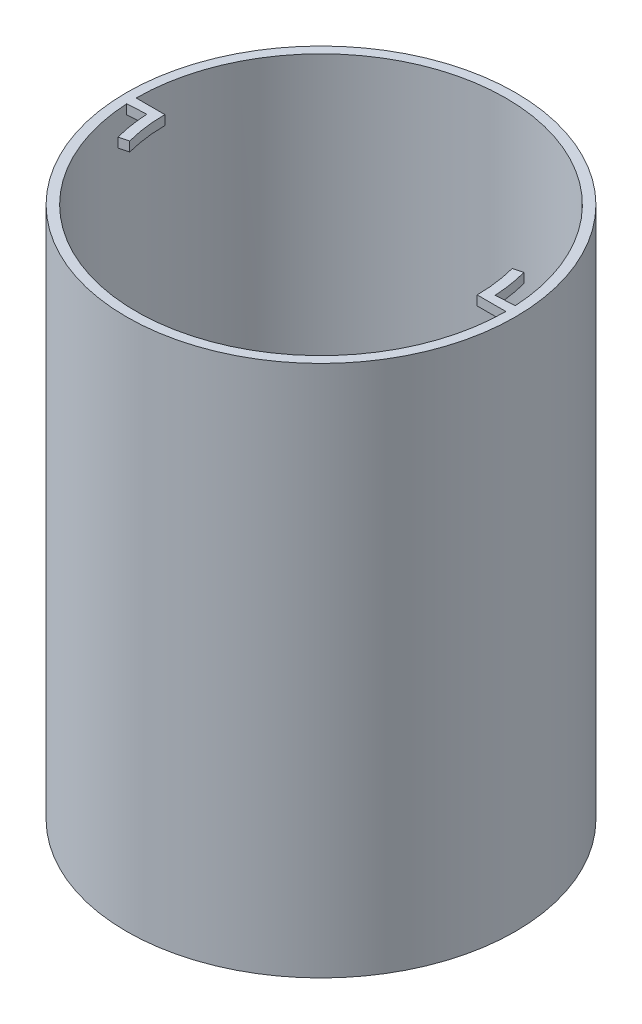
ISO-10303-21;
HEADER;
FILE_DESCRIPTION(('STEP AP214'),'2;1');
FILE_NAME('part.step','',(''),(''),'','','');
FILE_SCHEMA(('AUTOMOTIVE_DESIGN { 1 0 10303 214 1 1 1 1 }'));
ENDSEC;
DATA;
#1=APPLICATION_CONTEXT('core data for automotive mechanical design processes');
#2=APPLICATION_PROTOCOL_DEFINITION('international standard','automotive_design',2000,#1);
#3=PRODUCT_CONTEXT('',#1,'mechanical');
#4=PRODUCT('Part','Part','',(#3));
#5=PRODUCT_RELATED_PRODUCT_CATEGORY('part','',(#4));
#6=PRODUCT_DEFINITION_FORMATION('','',#4);
#7=PRODUCT_DEFINITION_CONTEXT('part definition',#1,'design');
#8=PRODUCT_DEFINITION('design','',#6,#7);
#9=PRODUCT_DEFINITION_SHAPE('','',#8);
#10=(LENGTH_UNIT() NAMED_UNIT(*) SI_UNIT(.MILLI.,.METRE.));
#11=(NAMED_UNIT(*) PLANE_ANGLE_UNIT() SI_UNIT($,.RADIAN.));
#12=(NAMED_UNIT(*) SI_UNIT($,.STERADIAN.) SOLID_ANGLE_UNIT());
#13=UNCERTAINTY_MEASURE_WITH_UNIT(LENGTH_MEASURE(1.E-05),#10,'distance_accuracy_value','');
#14=(GEOMETRIC_REPRESENTATION_CONTEXT(3) GLOBAL_UNCERTAINTY_ASSIGNED_CONTEXT((#13)) GLOBAL_UNIT_ASSIGNED_CONTEXT((#10,
#11,#12)) REPRESENTATION_CONTEXT('',''));
#15=CARTESIAN_POINT('',(0.,0.,0.));
#16=DIRECTION('',(0.,0.,1.));
#17=DIRECTION('',(1.,0.,0.));
#18=AXIS2_PLACEMENT_3D('',#15,#16,#17);
#19=CARTESIAN_POINT('',(0.,0.,0.));
#20=DIRECTION('',(0.,-1.,0.));
#21=DIRECTION('',(0.,0.,-1.));
#22=AXIS2_PLACEMENT_3D('',#19,#20,#21);
#23=CYLINDRICAL_SURFACE('',#22,58.);
#24=CARTESIAN_POINT('',(0.,0.,0.));
#25=DIRECTION('',(0.,-1.,0.));
#26=DIRECTION('',(0.,0.,-1.));
#27=AXIS2_PLACEMENT_3D('',#24,#25,#26);
#28=CIRCLE('',#27,58.);
#29=CARTESIAN_POINT('',(0.,0.,-58.));
#30=VERTEX_POINT('',#29);
#31=EDGE_CURVE('E223',#30,#30,#28,.T.);
#32=ORIENTED_EDGE('',*,*,#31,.T.);
#33=EDGE_LOOP('',(#32));
#34=FACE_BOUND('',#33,.T.);
#35=CARTESIAN_POINT('',(0.,164.,0.));
#36=DIRECTION('',(0.,-1.,0.));
#37=DIRECTION('',(1.,0.,0.));
#38=AXIS2_PLACEMENT_3D('',#35,#36,#37);
#39=CIRCLE('',#38,58.);
#40=CARTESIAN_POINT('',(57.9205130157653,164.,-3.03548546209075));
#41=VERTEX_POINT('',#40);
#42=CARTESIAN_POINT('',(58.,164.,0.));
#43=VERTEX_POINT('',#42);
#44=EDGE_CURVE('E50',#41,#43,#39,.T.);
#45=ORIENTED_EDGE('',*,*,#44,.F.);
#46=DIRECTION('',(0.,1.,0.));
#47=VECTOR('',#46,1.);
#48=CARTESIAN_POINT('',(57.9205130157653,0.,-3.03548546209075));
#49=LINE('',#48,#47);
#50=CARTESIAN_POINT('',(57.9205130157653,167.,-3.03548546209075));
#51=VERTEX_POINT('',#50);
#52=EDGE_CURVE('E192',#41,#51,#49,.T.);
#53=ORIENTED_EDGE('',*,*,#52,.T.);
#54=CARTESIAN_POINT('',(0.,167.,0.));
#55=DIRECTION('',(0.,-1.,0.));
#56=DIRECTION('',(0.,0.,-1.));
#57=AXIS2_PLACEMENT_3D('',#54,#55,#56);
#58=CIRCLE('',#57,58.);
#59=CARTESIAN_POINT('',(-58.,167.,0.));
#60=VERTEX_POINT('',#59);
#61=EDGE_CURVE('E43',#60,#51,#58,.T.);
#62=ORIENTED_EDGE('',*,*,#61,.F.);
#63=DIRECTION('',(0.,1.,0.));
#64=VECTOR('',#63,1.);
#65=CARTESIAN_POINT('',(-58.,0.,0.));
#66=LINE('',#65,#64);
#67=CARTESIAN_POINT('',(-58.,164.,0.));
#68=VERTEX_POINT('',#67);
#69=EDGE_CURVE('E204',#68,#60,#66,.T.);
#70=ORIENTED_EDGE('',*,*,#69,.F.);
#71=CARTESIAN_POINT('',(0.,164.,0.));
#72=DIRECTION('',(0.,-1.,0.));
#73=DIRECTION('',(1.,0.,0.));
#74=AXIS2_PLACEMENT_3D('',#71,#72,#73);
#75=CIRCLE('',#74,58.);
#76=CARTESIAN_POINT('',(-57.9205130157653,164.,3.03548546209075));
#77=VERTEX_POINT('',#76);
#78=EDGE_CURVE('E217',#77,#68,#75,.T.);
#79=ORIENTED_EDGE('',*,*,#78,.F.);
#80=DIRECTION('',(0.,1.,0.));
#81=VECTOR('',#80,1.);
#82=CARTESIAN_POINT('',(-57.9205130157653,0.,3.03548546209075));
#83=LINE('',#82,#81);
#84=CARTESIAN_POINT('',(-57.9205130157653,167.,3.03548546209075));
#85=VERTEX_POINT('',#84);
#86=EDGE_CURVE('E214',#77,#85,#83,.T.);
#87=ORIENTED_EDGE('',*,*,#86,.T.);
#88=CARTESIAN_POINT('',(58.,167.,0.));
#89=VERTEX_POINT('',#88);
#90=EDGE_CURVE('E225',#89,#85,#58,.T.);
#91=ORIENTED_EDGE('',*,*,#90,.F.);
#92=DIRECTION('',(0.,1.,0.));
#93=VECTOR('',#92,1.);
#94=CARTESIAN_POINT('',(58.,0.,0.));
#95=LINE('',#94,#93);
#96=EDGE_CURVE('E55',#43,#89,#95,.T.);
#97=ORIENTED_EDGE('',*,*,#96,.F.);
#98=EDGE_LOOP('',(#45,#53,#62,#70,#79,#87,#91,#97));
#99=FACE_BOUND('',#98,.T.);
#100=ADVANCED_FACE('F35',(#34,#99),#23,.F.);
#101=CARTESIAN_POINT('',(0.,0.,0.));
#102=DIRECTION('',(0.,-1.,0.));
#103=DIRECTION('',(0.,0.,-1.));
#104=AXIS2_PLACEMENT_3D('',#101,#102,#103);
#105=CYLINDRICAL_SURFACE('',#104,61.);
#106=CARTESIAN_POINT('',(0.,167.,0.));
#107=DIRECTION('',(0.,-1.,0.));
#108=DIRECTION('',(0.,0.,-1.));
#109=AXIS2_PLACEMENT_3D('',#106,#107,#108);
#110=CIRCLE('',#109,61.);
#111=CARTESIAN_POINT('',(0.,167.,-61.));
#112=VERTEX_POINT('',#111);
#113=EDGE_CURVE('E11',#112,#112,#110,.T.);
#114=ORIENTED_EDGE('',*,*,#113,.T.);
#115=EDGE_LOOP('',(#114));
#116=FACE_BOUND('',#115,.T.);
#117=CARTESIAN_POINT('',(0.,0.,0.));
#118=DIRECTION('',(0.,-1.,0.));
#119=DIRECTION('',(0.,0.,-1.));
#120=AXIS2_PLACEMENT_3D('',#117,#118,#119);
#121=CIRCLE('',#120,61.);
#122=CARTESIAN_POINT('',(0.,0.,-61.));
#123=VERTEX_POINT('',#122);
#124=EDGE_CURVE('E220',#123,#123,#121,.T.);
#125=ORIENTED_EDGE('',*,*,#124,.F.);
#126=EDGE_LOOP('',(#125));
#127=FACE_BOUND('',#126,.T.);
#128=ADVANCED_FACE('F37',(#116,#127),#105,.T.);
#129=CARTESIAN_POINT('',(61.,167.,0.));
#130=DIRECTION('',(0.,1.,0.));
#131=DIRECTION('',(0.,0.,1.));
#132=AXIS2_PLACEMENT_3D('',#129,#130,#131);
#133=PLANE('',#132);
#134=ORIENTED_EDGE('',*,*,#61,.T.);
#135=DIRECTION('',(-0.998629534754574,0.,0.0523359562429439));
#136=VECTOR('',#135,1.);
#137=CARTESIAN_POINT('',(0.,167.,0.));
#138=LINE('',#137,#136);
#139=CARTESIAN_POINT('',(51.9287358072379,167.,-2.72146972463309));
#140=VERTEX_POINT('',#139);
#141=EDGE_CURVE('E194',#51,#140,#138,.T.);
#142=ORIENTED_EDGE('',*,*,#141,.T.);
#143=CARTESIAN_POINT('',(0.,167.,0.));
#144=DIRECTION('',(0.,-1.,0.));
#145=DIRECTION('',(1.,0.,0.));
#146=AXIS2_PLACEMENT_3D('',#143,#144,#145);
#147=CIRCLE('',#146,52.);
#148=CARTESIAN_POINT('',(50.2281429670316,167.,-13.4585903453311));
#149=VERTEX_POINT('',#148);
#150=EDGE_CURVE('E141',#149,#140,#147,.T.);
#151=ORIENTED_EDGE('',*,*,#150,.F.);
#152=DIRECTION('',(-0.965925826289068,0.,0.258819045102521));
#153=VECTOR('',#152,1.);
#154=CARTESIAN_POINT('',(0.,167.,0.));
#155=LINE('',#154,#153);
#156=CARTESIAN_POINT('',(47.3303654881643,167.,-12.6821332100235));
#157=VERTEX_POINT('',#156);
#158=EDGE_CURVE('E137',#149,#157,#155,.T.);
#159=ORIENTED_EDGE('',*,*,#158,.T.);
#160=CARTESIAN_POINT('',(0.,167.,0.));
#161=DIRECTION('',(0.,-1.,0.));
#162=DIRECTION('',(1.,0.,0.));
#163=AXIS2_PLACEMENT_3D('',#160,#161,#162);
#164=CIRCLE('',#163,49.);
#165=CARTESIAN_POINT('',(49.,167.,0.));
#166=VERTEX_POINT('',#165);
#167=EDGE_CURVE('E132',#157,#166,#164,.T.);
#168=ORIENTED_EDGE('',*,*,#167,.T.);
#169=DIRECTION('',(-1.,0.,0.));
#170=VECTOR('',#169,1.);
#171=CARTESIAN_POINT('',(0.,167.,0.));
#172=LINE('',#171,#170);
#173=EDGE_CURVE('E122',#89,#166,#172,.T.);
#174=ORIENTED_EDGE('',*,*,#173,.F.);
#175=ORIENTED_EDGE('',*,*,#90,.T.);
#176=DIRECTION('',(0.998629534754574,0.,-0.0523359562429439));
#177=VECTOR('',#176,1.);
#178=CARTESIAN_POINT('',(0.,167.,0.));
#179=LINE('',#178,#177);
#180=CARTESIAN_POINT('',(-51.9287358072378,167.,2.72146972463309));
#181=VERTEX_POINT('',#180);
#182=EDGE_CURVE('E211',#85,#181,#179,.T.);
#183=ORIENTED_EDGE('',*,*,#182,.T.);
#184=CARTESIAN_POINT('',(0.,167.,0.));
#185=DIRECTION('',(0.,-1.,0.));
#186=DIRECTION('',(1.,0.,0.));
#187=AXIS2_PLACEMENT_3D('',#184,#185,#186);
#188=CIRCLE('',#187,52.);
#189=CARTESIAN_POINT('',(-50.2281429670316,167.,13.4585903453311));
#190=VERTEX_POINT('',#189);
#191=EDGE_CURVE('E180',#190,#181,#188,.T.);
#192=ORIENTED_EDGE('',*,*,#191,.F.);
#193=DIRECTION('',(0.965925826289068,0.,-0.258819045102521));
#194=VECTOR('',#193,1.);
#195=CARTESIAN_POINT('',(-1.49194084614065E-12,167.,4.03482886914229E-13));
#196=LINE('',#195,#194);
#197=CARTESIAN_POINT('',(-47.3303654881643,167.,12.6821332100236));
#198=VERTEX_POINT('',#197);
#199=EDGE_CURVE('E171',#190,#198,#196,.T.);
#200=ORIENTED_EDGE('',*,*,#199,.T.);
#201=CARTESIAN_POINT('',(0.,167.,0.));
#202=DIRECTION('',(0.,-1.,0.));
#203=DIRECTION('',(1.,0.,0.));
#204=AXIS2_PLACEMENT_3D('',#201,#202,#203);
#205=CIRCLE('',#204,49.);
#206=CARTESIAN_POINT('',(-49.,167.,0.));
#207=VERTEX_POINT('',#206);
#208=EDGE_CURVE('E182',#198,#207,#205,.T.);
#209=ORIENTED_EDGE('',*,*,#208,.T.);
#210=DIRECTION('',(1.,0.,0.));
#211=VECTOR('',#210,1.);
#212=CARTESIAN_POINT('',(0.,167.,0.));
#213=LINE('',#212,#211);
#214=EDGE_CURVE('E202',#60,#207,#213,.T.);
#215=ORIENTED_EDGE('',*,*,#214,.F.);
#216=EDGE_LOOP('',(#134,#142,#151,#159,#168,#174,#175,#183,#192,#200,#209,#215));
#217=FACE_BOUND('',#216,.T.);
#218=ORIENTED_EDGE('',*,*,#113,.F.);
#219=EDGE_LOOP('',(#218));
#220=FACE_BOUND('',#219,.T.);
#221=ADVANCED_FACE('F134',(#217,#220),#133,.T.);
#222=CARTESIAN_POINT('',(58.,0.,0.));
#223=DIRECTION('',(0.,-1.,0.));
#224=DIRECTION('',(0.,0.,-1.));
#225=AXIS2_PLACEMENT_3D('',#222,#223,#224);
#226=PLANE('',#225);
#227=ORIENTED_EDGE('',*,*,#124,.T.);
#228=EDGE_LOOP('',(#227));
#229=FACE_BOUND('',#228,.T.);
#230=ORIENTED_EDGE('',*,*,#31,.F.);
#231=EDGE_LOOP('',(#230));
#232=FACE_BOUND('',#231,.T.);
#233=ADVANCED_FACE('F280',(#229,#232),#226,.T.);
#234=CARTESIAN_POINT('',(0.,164.,0.));
#235=DIRECTION('',(0.,-1.,0.));
#236=DIRECTION('',(1.,0.,0.));
#237=AXIS2_PLACEMENT_3D('',#234,#235,#236);
#238=PLANE('',#237);
#239=DIRECTION('',(-1.,0.,0.));
#240=VECTOR('',#239,1.);
#241=CARTESIAN_POINT('',(0.,164.,0.));
#242=LINE('',#241,#240);
#243=CARTESIAN_POINT('',(-49.,164.,0.));
#244=VERTEX_POINT('',#243);
#245=EDGE_CURVE('E200',#244,#68,#242,.T.);
#246=ORIENTED_EDGE('',*,*,#245,.F.);
#247=CARTESIAN_POINT('',(0.,164.,0.));
#248=DIRECTION('',(0.,-1.,0.));
#249=DIRECTION('',(1.,0.,0.));
#250=AXIS2_PLACEMENT_3D('',#247,#248,#249);
#251=CIRCLE('',#250,49.);
#252=CARTESIAN_POINT('',(-47.3303654881643,164.,12.6821332100236));
#253=VERTEX_POINT('',#252);
#254=EDGE_CURVE('E185',#253,#244,#251,.T.);
#255=ORIENTED_EDGE('',*,*,#254,.F.);
#256=DIRECTION('',(-0.965925826289068,0.,0.258819045102521));
#257=VECTOR('',#256,1.);
#258=CARTESIAN_POINT('',(0.,164.,0.));
#259=LINE('',#258,#257);
#260=CARTESIAN_POINT('',(-50.2281429670316,164.,13.4585903453311));
#261=VERTEX_POINT('',#260);
#262=EDGE_CURVE('E165',#253,#261,#259,.T.);
#263=ORIENTED_EDGE('',*,*,#262,.T.);
#264=CARTESIAN_POINT('',(0.,164.,0.));
#265=DIRECTION('',(0.,-1.,0.));
#266=DIRECTION('',(1.,0.,0.));
#267=AXIS2_PLACEMENT_3D('',#264,#265,#266);
#268=CIRCLE('',#267,52.);
#269=CARTESIAN_POINT('',(-51.9287358072378,164.,2.72146972463309));
#270=VERTEX_POINT('',#269);
#271=EDGE_CURVE('E177',#261,#270,#268,.T.);
#272=ORIENTED_EDGE('',*,*,#271,.T.);
#273=DIRECTION('',(-0.998629534754574,0.,0.0523359562429439));
#274=VECTOR('',#273,1.);
#275=CARTESIAN_POINT('',(0.,164.,0.));
#276=LINE('',#275,#274);
#277=EDGE_CURVE('E207',#270,#77,#276,.T.);
#278=ORIENTED_EDGE('',*,*,#277,.T.);
#279=ORIENTED_EDGE('',*,*,#78,.T.);
#280=EDGE_LOOP('',(#246,#255,#263,#272,#278,#279));
#281=FACE_BOUND('',#280,.T.);
#282=ADVANCED_FACE('F237',(#281),#238,.T.);
#283=CARTESIAN_POINT('',(0.,0.,0.));
#284=DIRECTION('',(0.0523359562429439,0.,0.998629534754574));
#285=DIRECTION('',(0.998629534754574,0.,-0.0523359562429439));
#286=AXIS2_PLACEMENT_3D('',#283,#284,#285);
#287=PLANE('',#286);
#288=ORIENTED_EDGE('',*,*,#277,.F.);
#289=DIRECTION('',(0.,-1.,0.));
#290=VECTOR('',#289,1.);
#291=CARTESIAN_POINT('',(-51.9287358072378,0.,2.72146972463308));
#292=LINE('',#291,#290);
#293=EDGE_CURVE('E209',#181,#270,#292,.T.);
#294=ORIENTED_EDGE('',*,*,#293,.F.);
#295=ORIENTED_EDGE('',*,*,#182,.F.);
#296=ORIENTED_EDGE('',*,*,#86,.F.);
#297=EDGE_LOOP('',(#288,#294,#295,#296));
#298=FACE_BOUND('',#297,.T.);
#299=ADVANCED_FACE('F233',(#298),#287,.T.);
#300=CARTESIAN_POINT('',(0.,0.,0.));
#301=DIRECTION('',(0.,0.,1.));
#302=DIRECTION('',(1.,0.,0.));
#303=AXIS2_PLACEMENT_3D('',#300,#301,#302);
#304=PLANE('',#303);
#305=ORIENTED_EDGE('',*,*,#245,.T.);
#306=ORIENTED_EDGE('',*,*,#69,.T.);
#307=ORIENTED_EDGE('',*,*,#214,.T.);
#308=DIRECTION('',(0.,-1.,0.));
#309=VECTOR('',#308,1.);
#310=CARTESIAN_POINT('',(-49.,0.,0.));
#311=LINE('',#310,#309);
#312=EDGE_CURVE('E162',#207,#244,#311,.T.);
#313=ORIENTED_EDGE('',*,*,#312,.T.);
#314=EDGE_LOOP('',(#305,#306,#307,#313));
#315=FACE_BOUND('',#314,.T.);
#316=ADVANCED_FACE('F250',(#315),#304,.F.);
#317=CARTESIAN_POINT('',(0.,164.,0.));
#318=DIRECTION('',(0.,-1.,0.));
#319=DIRECTION('',(1.,0.,0.));
#320=AXIS2_PLACEMENT_3D('',#317,#318,#319);
#321=PLANE('',#320);
#322=ORIENTED_EDGE('',*,*,#44,.T.);
#323=DIRECTION('',(1.,0.,0.));
#324=VECTOR('',#323,1.);
#325=CARTESIAN_POINT('',(0.,164.,0.));
#326=LINE('',#325,#324);
#327=CARTESIAN_POINT('',(49.,164.,0.));
#328=VERTEX_POINT('',#327);
#329=EDGE_CURVE('E188',#328,#43,#326,.T.);
#330=ORIENTED_EDGE('',*,*,#329,.F.);
#331=CARTESIAN_POINT('',(0.,164.,0.));
#332=DIRECTION('',(0.,-1.,0.));
#333=DIRECTION('',(1.,0.,0.));
#334=AXIS2_PLACEMENT_3D('',#331,#332,#333);
#335=CIRCLE('',#334,49.);
#336=CARTESIAN_POINT('',(47.3303654881643,164.,-12.6821332100235));
#337=VERTEX_POINT('',#336);
#338=EDGE_CURVE('E142',#337,#328,#335,.T.);
#339=ORIENTED_EDGE('',*,*,#338,.F.);
#340=DIRECTION('',(0.965925826289068,0.,-0.258819045102521));
#341=VECTOR('',#340,1.);
#342=CARTESIAN_POINT('',(0.,164.,0.));
#343=LINE('',#342,#341);
#344=CARTESIAN_POINT('',(50.2281429670316,164.,-13.4585903453311));
#345=VERTEX_POINT('',#344);
#346=EDGE_CURVE('E146',#337,#345,#343,.T.);
#347=ORIENTED_EDGE('',*,*,#346,.T.);
#348=CARTESIAN_POINT('',(0.,164.,0.));
#349=DIRECTION('',(0.,-1.,0.));
#350=DIRECTION('',(1.,0.,0.));
#351=AXIS2_PLACEMENT_3D('',#348,#349,#350);
#352=CIRCLE('',#351,52.);
#353=CARTESIAN_POINT('',(51.9287358072378,164.,-2.72146972463308));
#354=VERTEX_POINT('',#353);
#355=EDGE_CURVE('E159',#345,#354,#352,.T.);
#356=ORIENTED_EDGE('',*,*,#355,.T.);
#357=DIRECTION('',(0.998629534754574,0.,-0.0523359562429439));
#358=VECTOR('',#357,1.);
#359=CARTESIAN_POINT('',(0.,164.,0.));
#360=LINE('',#359,#358);
#361=EDGE_CURVE('E129',#354,#41,#360,.T.);
#362=ORIENTED_EDGE('',*,*,#361,.T.);
#363=EDGE_LOOP('',(#322,#330,#339,#347,#356,#362));
#364=FACE_BOUND('',#363,.T.);
#365=ADVANCED_FACE('F263',(#364),#321,.T.);
#366=CARTESIAN_POINT('',(0.,0.,0.));
#367=DIRECTION('',(0.0523359562429439,0.,0.998629534754574));
#368=DIRECTION('',(0.998629534754574,0.,-0.0523359562429439));
#369=AXIS2_PLACEMENT_3D('',#366,#367,#368);
#370=PLANE('',#369);
#371=ORIENTED_EDGE('',*,*,#361,.F.);
#372=DIRECTION('',(0.,-1.,0.));
#373=VECTOR('',#372,1.);
#374=CARTESIAN_POINT('',(51.9287358072378,0.,-2.72146972463309));
#375=LINE('',#374,#373);
#376=EDGE_CURVE('E197',#140,#354,#375,.T.);
#377=ORIENTED_EDGE('',*,*,#376,.F.);
#378=ORIENTED_EDGE('',*,*,#141,.F.);
#379=ORIENTED_EDGE('',*,*,#52,.F.);
#380=EDGE_LOOP('',(#371,#377,#378,#379));
#381=FACE_BOUND('',#380,.T.);
#382=ADVANCED_FACE('F254',(#381),#370,.F.);
#383=CARTESIAN_POINT('',(0.,0.,0.));
#384=DIRECTION('',(0.,0.,1.));
#385=DIRECTION('',(1.,0.,0.));
#386=AXIS2_PLACEMENT_3D('',#383,#384,#385);
#387=PLANE('',#386);
#388=ORIENTED_EDGE('',*,*,#329,.T.);
#389=ORIENTED_EDGE('',*,*,#96,.T.);
#390=ORIENTED_EDGE('',*,*,#173,.T.);
#391=DIRECTION('',(0.,-1.,0.));
#392=VECTOR('',#391,1.);
#393=CARTESIAN_POINT('',(49.,0.,0.));
#394=LINE('',#393,#392);
#395=EDGE_CURVE('E127',#166,#328,#394,.T.);
#396=ORIENTED_EDGE('',*,*,#395,.T.);
#397=EDGE_LOOP('',(#388,#389,#390,#396));
#398=FACE_BOUND('',#397,.T.);
#399=ADVANCED_FACE('F125',(#398),#387,.T.);
#400=CARTESIAN_POINT('',(0.,0.,0.));
#401=DIRECTION('',(0.,-1.,0.));
#402=DIRECTION('',(1.,0.,0.));
#403=AXIS2_PLACEMENT_3D('',#400,#401,#402);
#404=CYLINDRICAL_SURFACE('',#403,49.);
#405=ORIENTED_EDGE('',*,*,#208,.F.);
#406=DIRECTION('',(0.,-1.,0.));
#407=VECTOR('',#406,1.);
#408=CARTESIAN_POINT('',(-47.3303654881643,0.,12.6821332100235));
#409=LINE('',#408,#407);
#410=EDGE_CURVE('E168',#198,#253,#409,.T.);
#411=ORIENTED_EDGE('',*,*,#410,.T.);
#412=ORIENTED_EDGE('',*,*,#254,.T.);
#413=ORIENTED_EDGE('',*,*,#312,.F.);
#414=EDGE_LOOP('',(#405,#411,#412,#413));
#415=FACE_BOUND('',#414,.T.);
#416=ADVANCED_FACE('F247',(#415),#404,.F.);
#417=CARTESIAN_POINT('',(0.,0.,0.));
#418=DIRECTION('',(0.,-1.,0.));
#419=DIRECTION('',(1.,0.,0.));
#420=AXIS2_PLACEMENT_3D('',#417,#418,#419);
#421=CYLINDRICAL_SURFACE('',#420,52.);
#422=ORIENTED_EDGE('',*,*,#191,.T.);
#423=ORIENTED_EDGE('',*,*,#293,.T.);
#424=ORIENTED_EDGE('',*,*,#271,.F.);
#425=DIRECTION('',(0.,1.,0.));
#426=VECTOR('',#425,1.);
#427=CARTESIAN_POINT('',(-50.2281429670316,0.,13.4585903453311));
#428=LINE('',#427,#426);
#429=EDGE_CURVE('E174',#261,#190,#428,.T.);
#430=ORIENTED_EDGE('',*,*,#429,.T.);
#431=EDGE_LOOP('',(#422,#423,#424,#430));
#432=FACE_BOUND('',#431,.T.);
#433=ADVANCED_FACE('F241',(#432),#421,.T.);
#434=CARTESIAN_POINT('',(0.,0.,0.));
#435=DIRECTION('',(0.258819045102521,0.,0.965925826289068));
#436=DIRECTION('',(0.965925826289068,0.,-0.258819045102521));
#437=AXIS2_PLACEMENT_3D('',#434,#435,#436);
#438=PLANE('',#437);
#439=ORIENTED_EDGE('',*,*,#262,.F.);
#440=ORIENTED_EDGE('',*,*,#410,.F.);
#441=ORIENTED_EDGE('',*,*,#199,.F.);
#442=ORIENTED_EDGE('',*,*,#429,.F.);
#443=EDGE_LOOP('',(#439,#440,#441,#442));
#444=FACE_BOUND('',#443,.T.);
#445=ADVANCED_FACE('F245',(#444),#438,.T.);
#446=CARTESIAN_POINT('',(0.,0.,0.));
#447=DIRECTION('',(0.,-1.,0.));
#448=DIRECTION('',(1.,0.,0.));
#449=AXIS2_PLACEMENT_3D('',#446,#447,#448);
#450=CYLINDRICAL_SURFACE('',#449,52.);
#451=ORIENTED_EDGE('',*,*,#376,.T.);
#452=ORIENTED_EDGE('',*,*,#355,.F.);
#453=DIRECTION('',(0.,1.,0.));
#454=VECTOR('',#453,1.);
#455=CARTESIAN_POINT('',(50.2281429670316,0.,-13.4585903453311));
#456=LINE('',#455,#454);
#457=EDGE_CURVE('E149',#345,#149,#456,.T.);
#458=ORIENTED_EDGE('',*,*,#457,.T.);
#459=ORIENTED_EDGE('',*,*,#150,.T.);
#460=EDGE_LOOP('',(#451,#452,#458,#459));
#461=FACE_BOUND('',#460,.T.);
#462=ADVANCED_FACE('F258',(#461),#450,.T.);
#463=CARTESIAN_POINT('',(0.,0.,0.));
#464=DIRECTION('',(0.,-1.,0.));
#465=DIRECTION('',(1.,0.,0.));
#466=AXIS2_PLACEMENT_3D('',#463,#464,#465);
#467=CYLINDRICAL_SURFACE('',#466,49.);
#468=DIRECTION('',(0.,-1.,0.));
#469=VECTOR('',#468,1.);
#470=CARTESIAN_POINT('',(47.3303654881643,0.,-12.6821332100235));
#471=LINE('',#470,#469);
#472=EDGE_CURVE('E155',#157,#337,#471,.T.);
#473=ORIENTED_EDGE('',*,*,#472,.T.);
#474=ORIENTED_EDGE('',*,*,#338,.T.);
#475=ORIENTED_EDGE('',*,*,#395,.F.);
#476=ORIENTED_EDGE('',*,*,#167,.F.);
#477=EDGE_LOOP('',(#473,#474,#475,#476));
#478=FACE_BOUND('',#477,.T.);
#479=ADVANCED_FACE('F145',(#478),#467,.F.);
#480=CARTESIAN_POINT('',(0.,0.,0.));
#481=DIRECTION('',(0.258819045102521,0.,0.965925826289068));
#482=DIRECTION('',(0.965925826289068,0.,-0.258819045102521));
#483=AXIS2_PLACEMENT_3D('',#480,#481,#482);
#484=PLANE('',#483);
#485=ORIENTED_EDGE('',*,*,#346,.F.);
#486=ORIENTED_EDGE('',*,*,#472,.F.);
#487=ORIENTED_EDGE('',*,*,#158,.F.);
#488=ORIENTED_EDGE('',*,*,#457,.F.);
#489=EDGE_LOOP('',(#485,#486,#487,#488));
#490=FACE_BOUND('',#489,.T.);
#491=ADVANCED_FACE('F261',(#490),#484,.F.);
#492=CLOSED_SHELL('',(#100,#128,#221,#233,#282,#299,#316,#365,#382,#399,#416,#433,#445,#462,
#479,#491));
#493=MANIFOLD_SOLID_BREP('B2',#492);
#494=ADVANCED_BREP_SHAPE_REPRESENTATION('',(#18,#493),#14);
#495=SHAPE_DEFINITION_REPRESENTATION(#9,#494);
ENDSEC;
END-ISO-10303-21;
